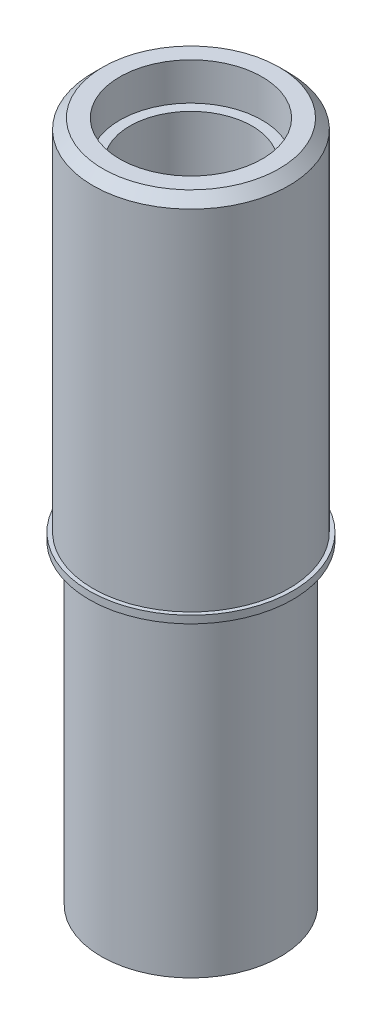
ISO-10303-21;
HEADER;
FILE_DESCRIPTION(('STEP AP214'),'2;1');
FILE_NAME('part.step','',(''),(''),'','','');
FILE_SCHEMA(('AUTOMOTIVE_DESIGN { 1 0 10303 214 1 1 1 1 }'));
ENDSEC;
DATA;
#1=APPLICATION_CONTEXT('core data for automotive mechanical design processes');
#2=APPLICATION_PROTOCOL_DEFINITION('international standard','automotive_design',2000,#1);
#3=PRODUCT_CONTEXT('',#1,'mechanical');
#4=PRODUCT('Part','Part','',(#3));
#5=PRODUCT_RELATED_PRODUCT_CATEGORY('part','',(#4));
#6=PRODUCT_DEFINITION_FORMATION('','',#4);
#7=PRODUCT_DEFINITION_CONTEXT('part definition',#1,'design');
#8=PRODUCT_DEFINITION('design','',#6,#7);
#9=PRODUCT_DEFINITION_SHAPE('','',#8);
#10=(LENGTH_UNIT() NAMED_UNIT(*) SI_UNIT(.MILLI.,.METRE.));
#11=(NAMED_UNIT(*) PLANE_ANGLE_UNIT() SI_UNIT($,.RADIAN.));
#12=(NAMED_UNIT(*) SI_UNIT($,.STERADIAN.) SOLID_ANGLE_UNIT());
#13=UNCERTAINTY_MEASURE_WITH_UNIT(LENGTH_MEASURE(1.E-05),#10,'distance_accuracy_value','');
#14=(GEOMETRIC_REPRESENTATION_CONTEXT(3) GLOBAL_UNCERTAINTY_ASSIGNED_CONTEXT((#13)) GLOBAL_UNIT_ASSIGNED_CONTEXT((#10,
#11,#12)) REPRESENTATION_CONTEXT('',''));
#15=CARTESIAN_POINT('',(0.,0.,0.));
#16=DIRECTION('',(0.,0.,1.));
#17=DIRECTION('',(1.,0.,0.));
#18=AXIS2_PLACEMENT_3D('',#15,#16,#17);
#19=CARTESIAN_POINT('',(0.,53.086,0.));
#20=DIRECTION('',(0.,1.,0.));
#21=DIRECTION('',(0.,0.,1.));
#22=AXIS2_PLACEMENT_3D('',#19,#20,#21);
#23=CYLINDRICAL_SURFACE('',#22,11.09345);
#24=CARTESIAN_POINT('',(0.,47.244,0.));
#25=DIRECTION('',(0.,1.,0.));
#26=DIRECTION('',(0.,0.,1.));
#27=AXIS2_PLACEMENT_3D('',#24,#25,#26);
#28=CIRCLE('',#27,11.09345);
#29=CARTESIAN_POINT('',(0.,47.244,11.09345));
#30=VERTEX_POINT('',#29);
#31=EDGE_CURVE('E44',#30,#30,#28,.T.);
#32=ORIENTED_EDGE('',*,*,#31,.F.);
#33=EDGE_LOOP('',(#32));
#34=FACE_BOUND('',#33,.T.);
#35=CARTESIAN_POINT('',(0.,53.086,0.));
#36=DIRECTION('',(0.,1.,0.));
#37=DIRECTION('',(0.,0.,1.));
#38=AXIS2_PLACEMENT_3D('',#35,#36,#37);
#39=CIRCLE('',#38,11.09345);
#40=CARTESIAN_POINT('',(0.,53.086,11.09345));
#41=VERTEX_POINT('',#40);
#42=EDGE_CURVE('E77',#41,#41,#39,.T.);
#43=ORIENTED_EDGE('',*,*,#42,.T.);
#44=EDGE_LOOP('',(#43));
#45=FACE_BOUND('',#44,.T.);
#46=ADVANCED_FACE('F33',(#34,#45),#23,.F.);
#47=CARTESIAN_POINT('',(0.,47.244,-9.525));
#48=DIRECTION('',(0.,-1.,0.));
#49=DIRECTION('',(0.,0.,-1.));
#50=AXIS2_PLACEMENT_3D('',#47,#48,#49);
#51=PLANE('',#50);
#52=CARTESIAN_POINT('',(0.,47.244,0.));
#53=DIRECTION('',(0.,1.,0.));
#54=DIRECTION('',(0.,0.,1.));
#55=AXIS2_PLACEMENT_3D('',#52,#53,#54);
#56=CIRCLE('',#55,9.52499999999998);
#57=CARTESIAN_POINT('',(0.,47.244,9.52499999999997));
#58=VERTEX_POINT('',#57);
#59=EDGE_CURVE('E48',#58,#58,#56,.T.);
#60=ORIENTED_EDGE('',*,*,#59,.F.);
#61=EDGE_LOOP('',(#60));
#62=FACE_BOUND('',#61,.T.);
#63=ORIENTED_EDGE('',*,*,#31,.T.);
#64=EDGE_LOOP('',(#63));
#65=FACE_BOUND('',#64,.T.);
#66=ADVANCED_FACE('F94',(#62,#65),#51,.F.);
#67=CARTESIAN_POINT('',(0.,53.086,0.));
#68=DIRECTION('',(0.,1.,0.));
#69=DIRECTION('',(0.,0.,1.));
#70=AXIS2_PLACEMENT_3D('',#67,#68,#69);
#71=CYLINDRICAL_SURFACE('',#70,9.52499999999998);
#72=CARTESIAN_POINT('',(0.,-47.244,0.));
#73=DIRECTION('',(0.,1.,0.));
#74=DIRECTION('',(0.,0.,1.));
#75=AXIS2_PLACEMENT_3D('',#72,#73,#74);
#76=CIRCLE('',#75,9.52499999999998);
#77=CARTESIAN_POINT('',(0.,-47.244,9.52499999999997));
#78=VERTEX_POINT('',#77);
#79=EDGE_CURVE('E53',#78,#78,#76,.T.);
#80=ORIENTED_EDGE('',*,*,#79,.F.);
#81=EDGE_LOOP('',(#80));
#82=FACE_BOUND('',#81,.T.);
#83=ORIENTED_EDGE('',*,*,#59,.T.);
#84=EDGE_LOOP('',(#83));
#85=FACE_BOUND('',#84,.T.);
#86=ADVANCED_FACE('F99',(#82,#85),#71,.F.);
#87=CARTESIAN_POINT('',(0.,-47.244,-9.525));
#88=DIRECTION('',(0.,1.,0.));
#89=DIRECTION('',(0.,0.,1.));
#90=AXIS2_PLACEMENT_3D('',#87,#88,#89);
#91=PLANE('',#90);
#92=CARTESIAN_POINT('',(0.,-47.244,0.));
#93=DIRECTION('',(0.,1.,0.));
#94=DIRECTION('',(0.,0.,1.));
#95=AXIS2_PLACEMENT_3D('',#92,#93,#94);
#96=CIRCLE('',#95,11.09345);
#97=CARTESIAN_POINT('',(0.,-47.244,11.09345));
#98=VERTEX_POINT('',#97);
#99=EDGE_CURVE('E56',#98,#98,#96,.T.);
#100=ORIENTED_EDGE('',*,*,#99,.F.);
#101=EDGE_LOOP('',(#100));
#102=FACE_BOUND('',#101,.T.);
#103=ORIENTED_EDGE('',*,*,#79,.T.);
#104=EDGE_LOOP('',(#103));
#105=FACE_BOUND('',#104,.T.);
#106=ADVANCED_FACE('F106',(#102,#105),#91,.F.);
#107=CARTESIAN_POINT('',(0.,53.086,0.));
#108=DIRECTION('',(0.,1.,0.));
#109=DIRECTION('',(0.,0.,1.));
#110=AXIS2_PLACEMENT_3D('',#107,#108,#109);
#111=CYLINDRICAL_SURFACE('',#110,11.09345);
#112=CARTESIAN_POINT('',(0.,-53.086,0.));
#113=DIRECTION('',(0.,1.,0.));
#114=DIRECTION('',(0.,0.,1.));
#115=AXIS2_PLACEMENT_3D('',#112,#113,#114);
#116=CIRCLE('',#115,11.09345);
#117=CARTESIAN_POINT('',(0.,-53.086,11.09345));
#118=VERTEX_POINT('',#117);
#119=EDGE_CURVE('E59',#118,#118,#116,.T.);
#120=ORIENTED_EDGE('',*,*,#119,.F.);
#121=EDGE_LOOP('',(#120));
#122=FACE_BOUND('',#121,.T.);
#123=ORIENTED_EDGE('',*,*,#99,.T.);
#124=EDGE_LOOP('',(#123));
#125=FACE_BOUND('',#124,.T.);
#126=ADVANCED_FACE('F110',(#122,#125),#111,.F.);
#127=CARTESIAN_POINT('',(0.,-53.086,-11.09345));
#128=DIRECTION('',(0.,1.,0.));
#129=DIRECTION('',(0.,0.,1.));
#130=AXIS2_PLACEMENT_3D('',#127,#128,#129);
#131=PLANE('',#130);
#132=CARTESIAN_POINT('',(0.,-53.086,0.));
#133=DIRECTION('',(0.,1.,0.));
#134=DIRECTION('',(0.,0.,1.));
#135=AXIS2_PLACEMENT_3D('',#132,#133,#134);
#136=CIRCLE('',#135,13.97);
#137=CARTESIAN_POINT('',(0.,-53.086,13.97));
#138=VERTEX_POINT('',#137);
#139=EDGE_CURVE('E62',#138,#138,#136,.T.);
#140=ORIENTED_EDGE('',*,*,#139,.F.);
#141=EDGE_LOOP('',(#140));
#142=FACE_BOUND('',#141,.T.);
#143=ORIENTED_EDGE('',*,*,#119,.T.);
#144=EDGE_LOOP('',(#143));
#145=FACE_BOUND('',#144,.T.);
#146=ADVANCED_FACE('F114',(#142,#145),#131,.F.);
#147=CARTESIAN_POINT('',(0.,53.086,0.));
#148=DIRECTION('',(0.,1.,0.));
#149=DIRECTION('',(0.,0.,1.));
#150=AXIS2_PLACEMENT_3D('',#147,#148,#149);
#151=CYLINDRICAL_SURFACE('',#150,13.97);
#152=CARTESIAN_POINT('',(0.,-3.96099999999999,0.));
#153=DIRECTION('',(0.,1.,0.));
#154=DIRECTION('',(0.,0.,1.));
#155=AXIS2_PLACEMENT_3D('',#152,#153,#154);
#156=CIRCLE('',#155,13.97);
#157=CARTESIAN_POINT('',(0.,-3.96099999999999,13.97));
#158=VERTEX_POINT('',#157);
#159=EDGE_CURVE('E65',#158,#158,#156,.T.);
#160=ORIENTED_EDGE('',*,*,#159,.F.);
#161=EDGE_LOOP('',(#160));
#162=FACE_BOUND('',#161,.T.);
#163=ORIENTED_EDGE('',*,*,#139,.T.);
#164=EDGE_LOOP('',(#163));
#165=FACE_BOUND('',#164,.T.);
#166=ADVANCED_FACE('F118',(#162,#165),#151,.T.);
#167=CARTESIAN_POINT('',(0.,-3.96099999999999,-13.97));
#168=DIRECTION('',(0.,1.,0.));
#169=DIRECTION('',(0.,0.,1.));
#170=AXIS2_PLACEMENT_3D('',#167,#168,#169);
#171=PLANE('',#170);
#172=CARTESIAN_POINT('',(0.,-3.96099999999999,0.));
#173=DIRECTION('',(0.,1.,0.));
#174=DIRECTION('',(0.,0.,1.));
#175=AXIS2_PLACEMENT_3D('',#172,#173,#174);
#176=CIRCLE('',#175,15.875);
#177=CARTESIAN_POINT('',(0.,-3.96099999999999,15.875));
#178=VERTEX_POINT('',#177);
#179=EDGE_CURVE('E68',#178,#178,#176,.T.);
#180=ORIENTED_EDGE('',*,*,#179,.F.);
#181=EDGE_LOOP('',(#180));
#182=FACE_BOUND('',#181,.T.);
#183=ORIENTED_EDGE('',*,*,#159,.T.);
#184=EDGE_LOOP('',(#183));
#185=FACE_BOUND('',#184,.T.);
#186=ADVANCED_FACE('F122',(#182,#185),#171,.F.);
#187=CARTESIAN_POINT('',(0.,53.086,0.));
#188=DIRECTION('',(0.,1.,0.));
#189=DIRECTION('',(0.,0.,1.));
#190=AXIS2_PLACEMENT_3D('',#187,#188,#189);
#191=CYLINDRICAL_SURFACE('',#190,15.875);
#192=CARTESIAN_POINT('',(0.,-2.794000024,0.));
#193=DIRECTION('',(0.,1.,0.));
#194=DIRECTION('',(0.,0.,1.));
#195=AXIS2_PLACEMENT_3D('',#192,#193,#194);
#196=CIRCLE('',#195,15.875);
#197=CARTESIAN_POINT('',(0.,-2.794000024,15.875));
#198=VERTEX_POINT('',#197);
#199=EDGE_CURVE('E71',#198,#198,#196,.T.);
#200=ORIENTED_EDGE('',*,*,#199,.F.);
#201=EDGE_LOOP('',(#200));
#202=FACE_BOUND('',#201,.T.);
#203=ORIENTED_EDGE('',*,*,#179,.T.);
#204=EDGE_LOOP('',(#203));
#205=FACE_BOUND('',#204,.T.);
#206=ADVANCED_FACE('F126',(#202,#205),#191,.T.);
#207=CARTESIAN_POINT('',(0.,-2.794000024,-15.875));
#208=DIRECTION('',(0.,-1.,0.));
#209=DIRECTION('',(0.,0.,-1.));
#210=AXIS2_PLACEMENT_3D('',#207,#208,#209);
#211=PLANE('',#210);
#212=CARTESIAN_POINT('',(0.,-2.794000024,0.));
#213=DIRECTION('',(0.,1.,0.));
#214=DIRECTION('',(0.,0.,1.));
#215=AXIS2_PLACEMENT_3D('',#212,#213,#214);
#216=CIRCLE('',#215,15.2527);
#217=CARTESIAN_POINT('',(0.,-2.794000024,15.2527));
#218=VERTEX_POINT('',#217);
#219=EDGE_CURVE('E74',#218,#218,#216,.T.);
#220=ORIENTED_EDGE('',*,*,#219,.F.);
#221=EDGE_LOOP('',(#220));
#222=FACE_BOUND('',#221,.T.);
#223=ORIENTED_EDGE('',*,*,#199,.T.);
#224=EDGE_LOOP('',(#223));
#225=FACE_BOUND('',#224,.T.);
#226=ADVANCED_FACE('F91',(#222,#225),#211,.F.);
#227=CARTESIAN_POINT('',(0.,53.086,0.));
#228=DIRECTION('',(0.,1.,0.));
#229=DIRECTION('',(0.,0.,1.));
#230=AXIS2_PLACEMENT_3D('',#227,#228,#229);
#231=CYLINDRICAL_SURFACE('',#230,15.2527);
#232=CARTESIAN_POINT('',(0.,51.562,0.));
#233=DIRECTION('',(0.,-1.,0.));
#234=DIRECTION('',(0.,0.,-1.));
#235=AXIS2_PLACEMENT_3D('',#232,#233,#234);
#236=CIRCLE('',#235,15.2527);
#237=CARTESIAN_POINT('',(0.,51.562,-15.2527));
#238=VERTEX_POINT('',#237);
#239=EDGE_CURVE('E10',#238,#238,#236,.T.);
#240=ORIENTED_EDGE('',*,*,#239,.T.);
#241=EDGE_LOOP('',(#240));
#242=FACE_BOUND('',#241,.T.);
#243=ORIENTED_EDGE('',*,*,#219,.T.);
#244=EDGE_LOOP('',(#243));
#245=FACE_BOUND('',#244,.T.);
#246=ADVANCED_FACE('F84',(#242,#245),#231,.T.);
#247=CARTESIAN_POINT('',(0.,53.086,-15.2527));
#248=DIRECTION('',(0.,-1.,0.));
#249=DIRECTION('',(0.,0.,-1.));
#250=AXIS2_PLACEMENT_3D('',#247,#248,#249);
#251=PLANE('',#250);
#252=CARTESIAN_POINT('',(0.,53.086,0.));
#253=DIRECTION('',(0.,-1.,0.));
#254=DIRECTION('',(0.,0.,-1.));
#255=AXIS2_PLACEMENT_3D('',#252,#253,#254);
#256=CIRCLE('',#255,13.7287);
#257=CARTESIAN_POINT('',(0.,53.086,-13.7287));
#258=VERTEX_POINT('',#257);
#259=EDGE_CURVE('E40',#258,#258,#256,.F.);
#260=ORIENTED_EDGE('',*,*,#259,.T.);
#261=EDGE_LOOP('',(#260));
#262=FACE_BOUND('',#261,.T.);
#263=ORIENTED_EDGE('',*,*,#42,.F.);
#264=EDGE_LOOP('',(#263));
#265=FACE_BOUND('',#264,.T.);
#266=ADVANCED_FACE('F82',(#262,#265),#251,.F.);
#267=CARTESIAN_POINT('',(0.,53.086,0.));
#268=DIRECTION('',(0.,-1.,0.));
#269=DIRECTION('',(0.,0.,-1.));
#270=AXIS2_PLACEMENT_3D('',#267,#268,#269);
#271=CONICAL_SURFACE('',#270,13.7287,0.785398163397448);
#272=ORIENTED_EDGE('',*,*,#239,.F.);
#273=EDGE_LOOP('',(#272));
#274=FACE_BOUND('',#273,.T.);
#275=ORIENTED_EDGE('',*,*,#259,.F.);
#276=EDGE_LOOP('',(#275));
#277=FACE_BOUND('',#276,.T.);
#278=ADVANCED_FACE('F35',(#274,#277),#271,.T.);
#279=CLOSED_SHELL('',(#46,#66,#86,#106,#126,#146,#166,#186,#206,#226,#246,#266,#278));
#280=MANIFOLD_SOLID_BREP('B2',#279);
#281=ADVANCED_BREP_SHAPE_REPRESENTATION('',(#18,#280),#14);
#282=SHAPE_DEFINITION_REPRESENTATION(#9,#281);
ENDSEC;
END-ISO-10303-21;
